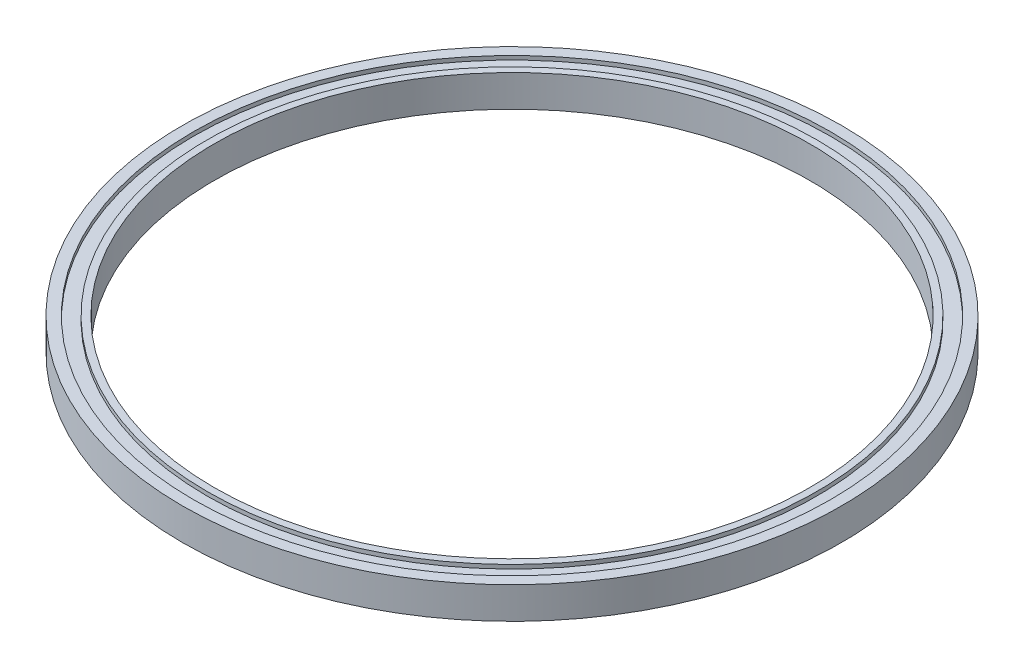
ISO-10303-21;
HEADER;
FILE_DESCRIPTION(('STEP AP214'),'2;1');
FILE_NAME('part.step','',(''),(''),'','','');
FILE_SCHEMA(('AUTOMOTIVE_DESIGN { 1 0 10303 214 1 1 1 1 }'));
ENDSEC;
DATA;
#1=APPLICATION_CONTEXT('core data for automotive mechanical design processes');
#2=APPLICATION_PROTOCOL_DEFINITION('international standard','automotive_design',2000,#1);
#3=PRODUCT_CONTEXT('',#1,'mechanical');
#4=PRODUCT('Part','Part','',(#3));
#5=PRODUCT_RELATED_PRODUCT_CATEGORY('part','',(#4));
#6=PRODUCT_DEFINITION_FORMATION('','',#4);
#7=PRODUCT_DEFINITION_CONTEXT('part definition',#1,'design');
#8=PRODUCT_DEFINITION('design','',#6,#7);
#9=PRODUCT_DEFINITION_SHAPE('','',#8);
#10=(LENGTH_UNIT() NAMED_UNIT(*) SI_UNIT(.MILLI.,.METRE.));
#11=(NAMED_UNIT(*) PLANE_ANGLE_UNIT() SI_UNIT($,.RADIAN.));
#12=(NAMED_UNIT(*) SI_UNIT($,.STERADIAN.) SOLID_ANGLE_UNIT());
#13=UNCERTAINTY_MEASURE_WITH_UNIT(LENGTH_MEASURE(1.E-05),#10,'distance_accuracy_value','');
#14=(GEOMETRIC_REPRESENTATION_CONTEXT(3) GLOBAL_UNCERTAINTY_ASSIGNED_CONTEXT((#13)) GLOBAL_UNIT_ASSIGNED_CONTEXT((#10,
#11,#12)) REPRESENTATION_CONTEXT('',''));
#15=CARTESIAN_POINT('',(0.,0.,0.));
#16=DIRECTION('',(0.,0.,1.));
#17=DIRECTION('',(1.,0.,0.));
#18=AXIS2_PLACEMENT_3D('',#15,#16,#17);
#19=CARTESIAN_POINT('',(0.,122.622277443433,0.));
#20=DIRECTION('',(0.,1.,0.));
#21=DIRECTION('',(0.,0.,1.));
#22=AXIS2_PLACEMENT_3D('',#19,#20,#21);
#23=CYLINDRICAL_SURFACE('',#22,75.);
#24=CARTESIAN_POINT('',(0.,-3.99999999999999,0.));
#25=DIRECTION('',(0.,1.,0.));
#26=DIRECTION('',(0.,0.,1.));
#27=AXIS2_PLACEMENT_3D('',#24,#25,#26);
#28=CIRCLE('',#27,75.);
#29=CARTESIAN_POINT('',(0.,-3.99999999999999,75.));
#30=VERTEX_POINT('',#29);
#31=EDGE_CURVE('E10',#30,#30,#28,.T.);
#32=ORIENTED_EDGE('',*,*,#31,.F.);
#33=EDGE_LOOP('',(#32));
#34=FACE_BOUND('',#33,.T.);
#35=CARTESIAN_POINT('',(0.,4.,0.));
#36=DIRECTION('',(0.,1.,0.));
#37=DIRECTION('',(0.,0.,1.));
#38=AXIS2_PLACEMENT_3D('',#35,#36,#37);
#39=CIRCLE('',#38,75.);
#40=CARTESIAN_POINT('',(0.,4.,75.));
#41=VERTEX_POINT('',#40);
#42=EDGE_CURVE('E74',#41,#41,#39,.T.);
#43=ORIENTED_EDGE('',*,*,#42,.T.);
#44=EDGE_LOOP('',(#43));
#45=FACE_BOUND('',#44,.T.);
#46=ADVANCED_FACE('F34',(#34,#45),#23,.F.);
#47=CARTESIAN_POINT('',(75.,-4.,0.));
#48=DIRECTION('',(0.,1.,0.));
#49=DIRECTION('',(0.,0.,1.));
#50=AXIS2_PLACEMENT_3D('',#47,#48,#49);
#51=PLANE('',#50);
#52=CARTESIAN_POINT('',(0.,-3.99999999999999,0.));
#53=DIRECTION('',(0.,1.,0.));
#54=DIRECTION('',(0.,0.,1.));
#55=AXIS2_PLACEMENT_3D('',#52,#53,#54);
#56=CIRCLE('',#55,76.75);
#57=CARTESIAN_POINT('',(0.,-3.99999999999999,76.75));
#58=VERTEX_POINT('',#57);
#59=EDGE_CURVE('E40',#58,#58,#56,.T.);
#60=ORIENTED_EDGE('',*,*,#59,.F.);
#61=EDGE_LOOP('',(#60));
#62=FACE_BOUND('',#61,.T.);
#63=ORIENTED_EDGE('',*,*,#31,.T.);
#64=EDGE_LOOP('',(#63));
#65=FACE_BOUND('',#64,.T.);
#66=ADVANCED_FACE('F135',(#62,#65),#51,.F.);
#67=CARTESIAN_POINT('',(0.,122.622277443433,0.));
#68=DIRECTION('',(0.,1.,0.));
#69=DIRECTION('',(0.,0.,1.));
#70=AXIS2_PLACEMENT_3D('',#67,#68,#69);
#71=CYLINDRICAL_SURFACE('',#70,76.75);
#72=CARTESIAN_POINT('',(0.,-2.99999999999999,0.));
#73=DIRECTION('',(0.,1.,0.));
#74=DIRECTION('',(0.,0.,1.));
#75=AXIS2_PLACEMENT_3D('',#72,#73,#74);
#76=CIRCLE('',#75,76.75);
#77=CARTESIAN_POINT('',(0.,-2.99999999999999,76.75));
#78=VERTEX_POINT('',#77);
#79=EDGE_CURVE('E44',#78,#78,#76,.T.);
#80=ORIENTED_EDGE('',*,*,#79,.F.);
#81=EDGE_LOOP('',(#80));
#82=FACE_BOUND('',#81,.T.);
#83=ORIENTED_EDGE('',*,*,#59,.T.);
#84=EDGE_LOOP('',(#83));
#85=FACE_BOUND('',#84,.T.);
#86=ADVANCED_FACE('F130',(#82,#85),#71,.T.);
#87=CARTESIAN_POINT('',(76.75,-3.,0.));
#88=DIRECTION('',(0.,1.,0.));
#89=DIRECTION('',(0.,0.,1.));
#90=AXIS2_PLACEMENT_3D('',#87,#88,#89);
#91=PLANE('',#90);
#92=CARTESIAN_POINT('',(0.,-2.99999999999999,0.));
#93=DIRECTION('',(0.,1.,0.));
#94=DIRECTION('',(0.,0.,1.));
#95=AXIS2_PLACEMENT_3D('',#92,#93,#94);
#96=CIRCLE('',#95,80.25);
#97=CARTESIAN_POINT('',(0.,-2.99999999999999,80.25));
#98=VERTEX_POINT('',#97);
#99=EDGE_CURVE('E48',#98,#98,#96,.T.);
#100=ORIENTED_EDGE('',*,*,#99,.F.);
#101=EDGE_LOOP('',(#100));
#102=FACE_BOUND('',#101,.T.);
#103=ORIENTED_EDGE('',*,*,#79,.T.);
#104=EDGE_LOOP('',(#103));
#105=FACE_BOUND('',#104,.T.);
#106=ADVANCED_FACE('F124',(#102,#105),#91,.F.);
#107=CARTESIAN_POINT('',(0.,122.622277443433,0.));
#108=DIRECTION('',(0.,1.,0.));
#109=DIRECTION('',(0.,0.,1.));
#110=AXIS2_PLACEMENT_3D('',#107,#108,#109);
#111=CYLINDRICAL_SURFACE('',#110,80.25);
#112=CARTESIAN_POINT('',(0.,-3.99999999999999,0.));
#113=DIRECTION('',(0.,1.,0.));
#114=DIRECTION('',(0.,0.,1.));
#115=AXIS2_PLACEMENT_3D('',#112,#113,#114);
#116=CIRCLE('',#115,80.25);
#117=CARTESIAN_POINT('',(0.,-3.99999999999999,80.25));
#118=VERTEX_POINT('',#117);
#119=EDGE_CURVE('E53',#118,#118,#116,.T.);
#120=ORIENTED_EDGE('',*,*,#119,.F.);
#121=EDGE_LOOP('',(#120));
#122=FACE_BOUND('',#121,.T.);
#123=ORIENTED_EDGE('',*,*,#99,.T.);
#124=EDGE_LOOP('',(#123));
#125=FACE_BOUND('',#124,.T.);
#126=ADVANCED_FACE('F118',(#122,#125),#111,.F.);
#127=CARTESIAN_POINT('',(80.25,-4.,0.));
#128=DIRECTION('',(0.,1.,0.));
#129=DIRECTION('',(0.,0.,1.));
#130=AXIS2_PLACEMENT_3D('',#127,#128,#129);
#131=PLANE('',#130);
#132=CARTESIAN_POINT('',(0.,-3.99999999999999,0.));
#133=DIRECTION('',(0.,1.,0.));
#134=DIRECTION('',(0.,0.,1.));
#135=AXIS2_PLACEMENT_3D('',#132,#133,#134);
#136=CIRCLE('',#135,83.);
#137=CARTESIAN_POINT('',(0.,-3.99999999999999,83.));
#138=VERTEX_POINT('',#137);
#139=EDGE_CURVE('E56',#138,#138,#136,.T.);
#140=ORIENTED_EDGE('',*,*,#139,.F.);
#141=EDGE_LOOP('',(#140));
#142=FACE_BOUND('',#141,.T.);
#143=ORIENTED_EDGE('',*,*,#119,.T.);
#144=EDGE_LOOP('',(#143));
#145=FACE_BOUND('',#144,.T.);
#146=ADVANCED_FACE('F112',(#142,#145),#131,.F.);
#147=CARTESIAN_POINT('',(0.,122.622277443433,0.));
#148=DIRECTION('',(0.,1.,0.));
#149=DIRECTION('',(0.,0.,1.));
#150=AXIS2_PLACEMENT_3D('',#147,#148,#149);
#151=CYLINDRICAL_SURFACE('',#150,83.);
#152=CARTESIAN_POINT('',(0.,4.,0.));
#153=DIRECTION('',(0.,1.,0.));
#154=DIRECTION('',(0.,0.,1.));
#155=AXIS2_PLACEMENT_3D('',#152,#153,#154);
#156=CIRCLE('',#155,83.);
#157=CARTESIAN_POINT('',(0.,4.,83.));
#158=VERTEX_POINT('',#157);
#159=EDGE_CURVE('E59',#158,#158,#156,.T.);
#160=ORIENTED_EDGE('',*,*,#159,.F.);
#161=EDGE_LOOP('',(#160));
#162=FACE_BOUND('',#161,.T.);
#163=ORIENTED_EDGE('',*,*,#139,.T.);
#164=EDGE_LOOP('',(#163));
#165=FACE_BOUND('',#164,.T.);
#166=ADVANCED_FACE('F106',(#162,#165),#151,.T.);
#167=CARTESIAN_POINT('',(80.25,4.,0.));
#168=DIRECTION('',(0.,-1.,0.));
#169=DIRECTION('',(0.,0.,-1.));
#170=AXIS2_PLACEMENT_3D('',#167,#168,#169);
#171=PLANE('',#170);
#172=CARTESIAN_POINT('',(0.,4.,0.));
#173=DIRECTION('',(0.,1.,0.));
#174=DIRECTION('',(0.,0.,1.));
#175=AXIS2_PLACEMENT_3D('',#172,#173,#174);
#176=CIRCLE('',#175,80.25);
#177=CARTESIAN_POINT('',(0.,4.,80.25));
#178=VERTEX_POINT('',#177);
#179=EDGE_CURVE('E62',#178,#178,#176,.T.);
#180=ORIENTED_EDGE('',*,*,#179,.F.);
#181=EDGE_LOOP('',(#180));
#182=FACE_BOUND('',#181,.T.);
#183=ORIENTED_EDGE('',*,*,#159,.T.);
#184=EDGE_LOOP('',(#183));
#185=FACE_BOUND('',#184,.T.);
#186=ADVANCED_FACE('F100',(#182,#185),#171,.F.);
#187=CARTESIAN_POINT('',(0.,122.622277443433,0.));
#188=DIRECTION('',(0.,1.,0.));
#189=DIRECTION('',(0.,0.,1.));
#190=AXIS2_PLACEMENT_3D('',#187,#188,#189);
#191=CYLINDRICAL_SURFACE('',#190,80.25);
#192=CARTESIAN_POINT('',(0.,3.,0.));
#193=DIRECTION('',(0.,1.,0.));
#194=DIRECTION('',(0.,0.,1.));
#195=AXIS2_PLACEMENT_3D('',#192,#193,#194);
#196=CIRCLE('',#195,80.25);
#197=CARTESIAN_POINT('',(0.,3.,80.25));
#198=VERTEX_POINT('',#197);
#199=EDGE_CURVE('E65',#198,#198,#196,.T.);
#200=ORIENTED_EDGE('',*,*,#199,.F.);
#201=EDGE_LOOP('',(#200));
#202=FACE_BOUND('',#201,.T.);
#203=ORIENTED_EDGE('',*,*,#179,.T.);
#204=EDGE_LOOP('',(#203));
#205=FACE_BOUND('',#204,.T.);
#206=ADVANCED_FACE('F94',(#202,#205),#191,.F.);
#207=CARTESIAN_POINT('',(76.75,3.,0.));
#208=DIRECTION('',(0.,-1.,0.));
#209=DIRECTION('',(0.,0.,-1.));
#210=AXIS2_PLACEMENT_3D('',#207,#208,#209);
#211=PLANE('',#210);
#212=CARTESIAN_POINT('',(0.,3.,0.));
#213=DIRECTION('',(0.,1.,0.));
#214=DIRECTION('',(0.,0.,1.));
#215=AXIS2_PLACEMENT_3D('',#212,#213,#214);
#216=CIRCLE('',#215,76.75);
#217=CARTESIAN_POINT('',(0.,3.,76.75));
#218=VERTEX_POINT('',#217);
#219=EDGE_CURVE('E68',#218,#218,#216,.T.);
#220=ORIENTED_EDGE('',*,*,#219,.F.);
#221=EDGE_LOOP('',(#220));
#222=FACE_BOUND('',#221,.T.);
#223=ORIENTED_EDGE('',*,*,#199,.T.);
#224=EDGE_LOOP('',(#223));
#225=FACE_BOUND('',#224,.T.);
#226=ADVANCED_FACE('F88',(#222,#225),#211,.F.);
#227=CARTESIAN_POINT('',(0.,122.622277443433,0.));
#228=DIRECTION('',(0.,1.,0.));
#229=DIRECTION('',(0.,0.,1.));
#230=AXIS2_PLACEMENT_3D('',#227,#228,#229);
#231=CYLINDRICAL_SURFACE('',#230,76.75);
#232=CARTESIAN_POINT('',(0.,4.,0.));
#233=DIRECTION('',(0.,1.,0.));
#234=DIRECTION('',(0.,0.,1.));
#235=AXIS2_PLACEMENT_3D('',#232,#233,#234);
#236=CIRCLE('',#235,76.75);
#237=CARTESIAN_POINT('',(0.,4.,76.75));
#238=VERTEX_POINT('',#237);
#239=EDGE_CURVE('E71',#238,#238,#236,.T.);
#240=ORIENTED_EDGE('',*,*,#239,.F.);
#241=EDGE_LOOP('',(#240));
#242=FACE_BOUND('',#241,.T.);
#243=ORIENTED_EDGE('',*,*,#219,.T.);
#244=EDGE_LOOP('',(#243));
#245=FACE_BOUND('',#244,.T.);
#246=ADVANCED_FACE('F82',(#242,#245),#231,.T.);
#247=CARTESIAN_POINT('',(75.,4.,0.));
#248=DIRECTION('',(0.,-1.,0.));
#249=DIRECTION('',(0.,0.,-1.));
#250=AXIS2_PLACEMENT_3D('',#247,#248,#249);
#251=PLANE('',#250);
#252=ORIENTED_EDGE('',*,*,#42,.F.);
#253=EDGE_LOOP('',(#252));
#254=FACE_BOUND('',#253,.T.);
#255=ORIENTED_EDGE('',*,*,#239,.T.);
#256=EDGE_LOOP('',(#255));
#257=FACE_BOUND('',#256,.T.);
#258=ADVANCED_FACE('F79',(#254,#257),#251,.F.);
#259=CLOSED_SHELL('',(#46,#66,#86,#106,#126,#146,#166,#186,#206,#226,#246,#258));
#260=MANIFOLD_SOLID_BREP('B2',#259);
#261=ADVANCED_BREP_SHAPE_REPRESENTATION('',(#18,#260),#14);
#262=SHAPE_DEFINITION_REPRESENTATION(#9,#261);
ENDSEC;
END-ISO-10303-21;
